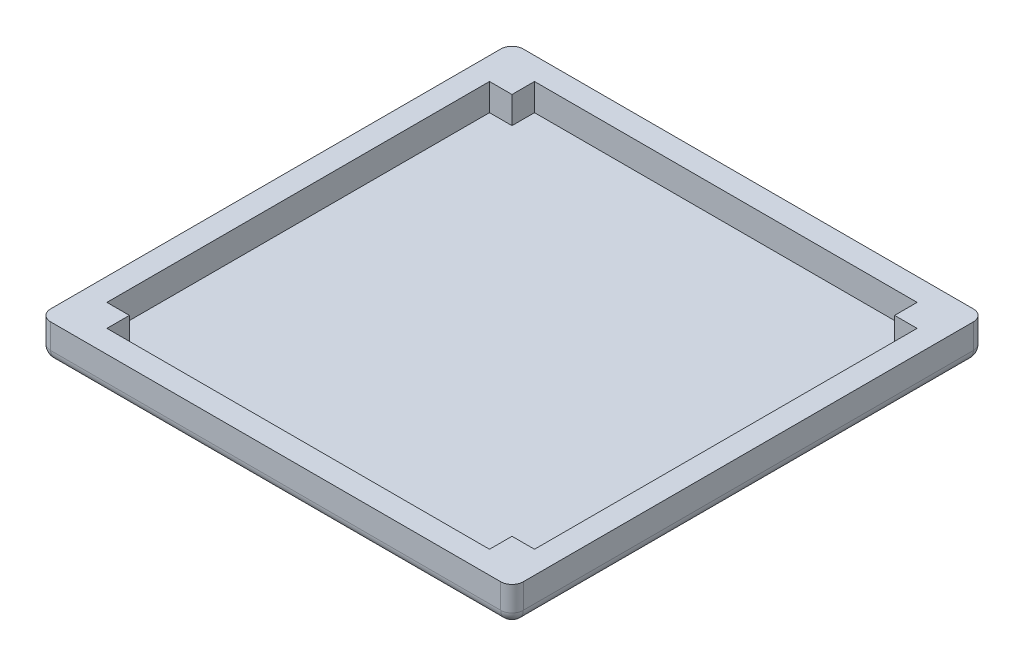
ISO-10303-21;
HEADER;
FILE_DESCRIPTION(('STEP AP214'),'2;1');
FILE_NAME('part.step','',(''),(''),'','','');
FILE_SCHEMA(('AUTOMOTIVE_DESIGN { 1 0 10303 214 1 1 1 1 }'));
ENDSEC;
DATA;
#1=APPLICATION_CONTEXT('core data for automotive mechanical design processes');
#2=APPLICATION_PROTOCOL_DEFINITION('international standard','automotive_design',2000,#1);
#3=PRODUCT_CONTEXT('',#1,'mechanical');
#4=PRODUCT('Part','Part','',(#3));
#5=PRODUCT_RELATED_PRODUCT_CATEGORY('part','',(#4));
#6=PRODUCT_DEFINITION_FORMATION('','',#4);
#7=PRODUCT_DEFINITION_CONTEXT('part definition',#1,'design');
#8=PRODUCT_DEFINITION('design','',#6,#7);
#9=PRODUCT_DEFINITION_SHAPE('','',#8);
#10=(LENGTH_UNIT() NAMED_UNIT(*) SI_UNIT(.MILLI.,.METRE.));
#11=(NAMED_UNIT(*) PLANE_ANGLE_UNIT() SI_UNIT($,.RADIAN.));
#12=(NAMED_UNIT(*) SI_UNIT($,.STERADIAN.) SOLID_ANGLE_UNIT());
#13=UNCERTAINTY_MEASURE_WITH_UNIT(LENGTH_MEASURE(1.E-05),#10,'distance_accuracy_value','');
#14=(GEOMETRIC_REPRESENTATION_CONTEXT(3) GLOBAL_UNCERTAINTY_ASSIGNED_CONTEXT((#13)) GLOBAL_UNIT_ASSIGNED_CONTEXT((#10,
#11,#12)) REPRESENTATION_CONTEXT('',''));
#15=CARTESIAN_POINT('',(0.,0.,0.));
#16=DIRECTION('',(0.,0.,1.));
#17=DIRECTION('',(1.,0.,0.));
#18=AXIS2_PLACEMENT_3D('',#15,#16,#17);
#19=CARTESIAN_POINT('',(105.,16.,105.));
#20=DIRECTION('',(-1.,0.,0.));
#21=DIRECTION('',(0.,0.,1.));
#22=AXIS2_PLACEMENT_3D('',#19,#20,#21);
#23=PLANE('',#22);
#24=DIRECTION('',(0.,0.,-1.));
#25=VECTOR('',#24,1.);
#26=CARTESIAN_POINT('',(105.,5.,-105.));
#27=LINE('',#26,#25);
#28=CARTESIAN_POINT('',(105.,5.,100.));
#29=VERTEX_POINT('',#28);
#30=CARTESIAN_POINT('',(105.,5.,-100.));
#31=VERTEX_POINT('',#30);
#32=EDGE_CURVE('E324',#29,#31,#27,.T.);
#33=ORIENTED_EDGE('',*,*,#32,.T.);
#34=DIRECTION('',(0.,-1.,0.));
#35=VECTOR('',#34,1.);
#36=CARTESIAN_POINT('',(105.,16.,-100.));
#37=LINE('',#36,#35);
#38=CARTESIAN_POINT('',(105.,16.,-100.));
#39=VERTEX_POINT('',#38);
#40=EDGE_CURVE('E353',#31,#39,#37,.F.);
#41=ORIENTED_EDGE('',*,*,#40,.T.);
#42=DIRECTION('',(0.,0.,-1.));
#43=VECTOR('',#42,1.);
#44=CARTESIAN_POINT('',(105.,16.,105.));
#45=LINE('',#44,#43);
#46=CARTESIAN_POINT('',(105.,16.,100.));
#47=VERTEX_POINT('',#46);
#48=EDGE_CURVE('E275',#47,#39,#45,.T.);
#49=ORIENTED_EDGE('',*,*,#48,.F.);
#50=DIRECTION('',(0.,-1.,0.));
#51=VECTOR('',#50,1.);
#52=CARTESIAN_POINT('',(105.,16.,100.));
#53=LINE('',#52,#51);
#54=EDGE_CURVE('E351',#47,#29,#53,.T.);
#55=ORIENTED_EDGE('',*,*,#54,.T.);
#56=EDGE_LOOP('',(#33,#41,#49,#55));
#57=FACE_BOUND('',#56,.T.);
#58=ADVANCED_FACE('F35',(#57),#23,.F.);
#59=CARTESIAN_POINT('',(-105.,16.,-105.));
#60=DIRECTION('',(0.,0.,1.));
#61=DIRECTION('',(1.,0.,0.));
#62=AXIS2_PLACEMENT_3D('',#59,#60,#61);
#63=PLANE('',#62);
#64=DIRECTION('',(-1.,0.,0.));
#65=VECTOR('',#64,1.);
#66=CARTESIAN_POINT('',(-105.,16.,-105.));
#67=LINE('',#66,#65);
#68=CARTESIAN_POINT('',(100.,16.,-105.));
#69=VERTEX_POINT('',#68);
#70=CARTESIAN_POINT('',(-100.,16.,-105.));
#71=VERTEX_POINT('',#70);
#72=EDGE_CURVE('E297',#69,#71,#67,.T.);
#73=ORIENTED_EDGE('',*,*,#72,.F.);
#74=DIRECTION('',(0.,-1.,0.));
#75=VECTOR('',#74,1.);
#76=CARTESIAN_POINT('',(100.,16.,-105.));
#77=LINE('',#76,#75);
#78=CARTESIAN_POINT('',(100.,5.,-105.));
#79=VERTEX_POINT('',#78);
#80=EDGE_CURVE('E349',#69,#79,#77,.T.);
#81=ORIENTED_EDGE('',*,*,#80,.T.);
#82=DIRECTION('',(-1.,0.,0.));
#83=VECTOR('',#82,1.);
#84=CARTESIAN_POINT('',(-105.,5.,-105.));
#85=LINE('',#84,#83);
#86=CARTESIAN_POINT('',(-100.,5.,-105.));
#87=VERTEX_POINT('',#86);
#88=EDGE_CURVE('E304',#79,#87,#85,.T.);
#89=ORIENTED_EDGE('',*,*,#88,.T.);
#90=DIRECTION('',(0.,-1.,0.));
#91=VECTOR('',#90,1.);
#92=CARTESIAN_POINT('',(-100.,16.,-105.));
#93=LINE('',#92,#91);
#94=EDGE_CURVE('E347',#87,#71,#93,.F.);
#95=ORIENTED_EDGE('',*,*,#94,.T.);
#96=EDGE_LOOP('',(#73,#81,#89,#95));
#97=FACE_BOUND('',#96,.T.);
#98=ADVANCED_FACE('F402',(#97),#63,.F.);
#99=CARTESIAN_POINT('',(-105.,16.,105.));
#100=DIRECTION('',(1.,0.,0.));
#101=DIRECTION('',(0.,0.,-1.));
#102=AXIS2_PLACEMENT_3D('',#99,#100,#101);
#103=PLANE('',#102);
#104=DIRECTION('',(0.,0.,1.));
#105=VECTOR('',#104,1.);
#106=CARTESIAN_POINT('',(-105.,16.,105.));
#107=LINE('',#106,#105);
#108=CARTESIAN_POINT('',(-105.,16.,-100.));
#109=VERTEX_POINT('',#108);
#110=CARTESIAN_POINT('',(-105.,16.,100.));
#111=VERTEX_POINT('',#110);
#112=EDGE_CURVE('E300',#109,#111,#107,.T.);
#113=ORIENTED_EDGE('',*,*,#112,.F.);
#114=DIRECTION('',(0.,-1.,0.));
#115=VECTOR('',#114,1.);
#116=CARTESIAN_POINT('',(-105.,16.,-100.));
#117=LINE('',#116,#115);
#118=CARTESIAN_POINT('',(-105.,5.,-100.));
#119=VERTEX_POINT('',#118);
#120=EDGE_CURVE('E11',#109,#119,#117,.T.);
#121=ORIENTED_EDGE('',*,*,#120,.T.);
#122=DIRECTION('',(0.,0.,1.));
#123=VECTOR('',#122,1.);
#124=CARTESIAN_POINT('',(-105.,5.,105.));
#125=LINE('',#124,#123);
#126=CARTESIAN_POINT('',(-105.,5.,100.));
#127=VERTEX_POINT('',#126);
#128=EDGE_CURVE('E319',#119,#127,#125,.T.);
#129=ORIENTED_EDGE('',*,*,#128,.T.);
#130=DIRECTION('',(0.,-1.,0.));
#131=VECTOR('',#130,1.);
#132=CARTESIAN_POINT('',(-105.,16.,100.));
#133=LINE('',#132,#131);
#134=EDGE_CURVE('E44',#127,#111,#133,.F.);
#135=ORIENTED_EDGE('',*,*,#134,.T.);
#136=EDGE_LOOP('',(#113,#121,#129,#135));
#137=FACE_BOUND('',#136,.T.);
#138=ADVANCED_FACE('F390',(#137),#103,.F.);
#139=CARTESIAN_POINT('',(-105.,16.,105.));
#140=DIRECTION('',(0.,0.,-1.));
#141=DIRECTION('',(-1.,0.,0.));
#142=AXIS2_PLACEMENT_3D('',#139,#140,#141);
#143=PLANE('',#142);
#144=DIRECTION('',(1.,0.,0.));
#145=VECTOR('',#144,1.);
#146=CARTESIAN_POINT('',(105.,5.,105.));
#147=LINE('',#146,#145);
#148=CARTESIAN_POINT('',(-100.,5.,105.));
#149=VERTEX_POINT('',#148);
#150=CARTESIAN_POINT('',(100.,5.,105.));
#151=VERTEX_POINT('',#150);
#152=EDGE_CURVE('E322',#149,#151,#147,.T.);
#153=ORIENTED_EDGE('',*,*,#152,.T.);
#154=DIRECTION('',(0.,-1.,0.));
#155=VECTOR('',#154,1.);
#156=CARTESIAN_POINT('',(100.,16.,105.));
#157=LINE('',#156,#155);
#158=CARTESIAN_POINT('',(100.,16.,105.));
#159=VERTEX_POINT('',#158);
#160=EDGE_CURVE('E52',#151,#159,#157,.F.);
#161=ORIENTED_EDGE('',*,*,#160,.T.);
#162=DIRECTION('',(1.,0.,0.));
#163=VECTOR('',#162,1.);
#164=CARTESIAN_POINT('',(-105.,16.,105.));
#165=LINE('',#164,#163);
#166=CARTESIAN_POINT('',(-100.,16.,105.));
#167=VERTEX_POINT('',#166);
#168=EDGE_CURVE('E302',#167,#159,#165,.T.);
#169=ORIENTED_EDGE('',*,*,#168,.F.);
#170=DIRECTION('',(0.,-1.,0.));
#171=VECTOR('',#170,1.);
#172=CARTESIAN_POINT('',(-100.,16.,105.));
#173=LINE('',#172,#171);
#174=EDGE_CURVE('E362',#167,#149,#173,.T.);
#175=ORIENTED_EDGE('',*,*,#174,.T.);
#176=EDGE_LOOP('',(#153,#161,#169,#175));
#177=FACE_BOUND('',#176,.T.);
#178=ADVANCED_FACE('F422',(#177),#143,.F.);
#179=CARTESIAN_POINT('',(0.,16.,0.));
#180=DIRECTION('',(0.,-1.,0.));
#181=DIRECTION('',(0.,0.,-1.));
#182=AXIS2_PLACEMENT_3D('',#179,#180,#181);
#183=PLANE('',#182);
#184=DIRECTION('',(-1.,0.,0.));
#185=VECTOR('',#184,1.);
#186=CARTESIAN_POINT('',(-95.0000000000035,16.,-85.0000000000036));
#187=LINE('',#186,#185);
#188=CARTESIAN_POINT('',(-85.0000000000035,16.,-85.0000000000035));
#189=VERTEX_POINT('',#188);
#190=CARTESIAN_POINT('',(-95.0000000000035,16.,-85.0000000000036));
#191=VERTEX_POINT('',#190);
#192=EDGE_CURVE('E244',#189,#191,#187,.T.);
#193=ORIENTED_EDGE('',*,*,#192,.F.);
#194=DIRECTION('',(0.,0.,1.));
#195=VECTOR('',#194,1.);
#196=CARTESIAN_POINT('',(-85.0000000000031,16.,-95.0000000000038));
#197=LINE('',#196,#195);
#198=CARTESIAN_POINT('',(-85.0000000000031,16.,-95.0000000000038));
#199=VERTEX_POINT('',#198);
#200=EDGE_CURVE('E194',#199,#189,#197,.T.);
#201=ORIENTED_EDGE('',*,*,#200,.F.);
#202=DIRECTION('',(-1.,0.,0.));
#203=VECTOR('',#202,1.);
#204=CARTESIAN_POINT('',(-85.0000000000031,16.,-95.0000000000038));
#205=LINE('',#204,#203);
#206=CARTESIAN_POINT('',(85.0000000000035,16.,-95.0000000000038));
#207=VERTEX_POINT('',#206);
#208=EDGE_CURVE('E212',#207,#199,#205,.T.);
#209=ORIENTED_EDGE('',*,*,#208,.F.);
#210=DIRECTION('',(0.,0.,-1.));
#211=VECTOR('',#210,1.);
#212=CARTESIAN_POINT('',(85.0000000000035,16.,-95.0000000000038));
#213=LINE('',#212,#211);
#214=CARTESIAN_POINT('',(85.0000000000035,16.,-85.0000000000036));
#215=VERTEX_POINT('',#214);
#216=EDGE_CURVE('E215',#215,#207,#213,.T.);
#217=ORIENTED_EDGE('',*,*,#216,.F.);
#218=DIRECTION('',(-1.,0.,0.));
#219=VECTOR('',#218,1.);
#220=CARTESIAN_POINT('',(95.0000000000039,16.,-85.0000000000036));
#221=LINE('',#220,#219);
#222=CARTESIAN_POINT('',(95.0000000000039,16.,-85.0000000000036));
#223=VERTEX_POINT('',#222);
#224=EDGE_CURVE('E268',#223,#215,#221,.T.);
#225=ORIENTED_EDGE('',*,*,#224,.F.);
#226=DIRECTION('',(0.,0.,-1.));
#227=VECTOR('',#226,1.);
#228=CARTESIAN_POINT('',(95.0000000000039,16.,-85.0000000000036));
#229=LINE('',#228,#227);
#230=CARTESIAN_POINT('',(95.0000000000039,16.,85.0000000000031));
#231=VERTEX_POINT('',#230);
#232=EDGE_CURVE('E265',#231,#223,#229,.T.);
#233=ORIENTED_EDGE('',*,*,#232,.F.);
#234=DIRECTION('',(1.,0.,0.));
#235=VECTOR('',#234,1.);
#236=CARTESIAN_POINT('',(95.0000000000039,16.,85.0000000000031));
#237=LINE('',#236,#235);
#238=CARTESIAN_POINT('',(85.0000000000035,16.,85.0000000000031));
#239=VERTEX_POINT('',#238);
#240=EDGE_CURVE('E262',#239,#231,#237,.T.);
#241=ORIENTED_EDGE('',*,*,#240,.F.);
#242=DIRECTION('',(0.,0.,-1.));
#243=VECTOR('',#242,1.);
#244=CARTESIAN_POINT('',(85.0000000000035,16.,95.0000000000035));
#245=LINE('',#244,#243);
#246=CARTESIAN_POINT('',(85.0000000000035,16.,95.0000000000035));
#247=VERTEX_POINT('',#246);
#248=EDGE_CURVE('E259',#247,#239,#245,.T.);
#249=ORIENTED_EDGE('',*,*,#248,.F.);
#250=DIRECTION('',(1.,0.,0.));
#251=VECTOR('',#250,1.);
#252=CARTESIAN_POINT('',(-85.0000000000031,16.,95.0000000000034));
#253=LINE('',#252,#251);
#254=CARTESIAN_POINT('',(-85.0000000000031,16.,95.0000000000034));
#255=VERTEX_POINT('',#254);
#256=EDGE_CURVE('E256',#255,#247,#253,.T.);
#257=ORIENTED_EDGE('',*,*,#256,.F.);
#258=DIRECTION('',(0.,0.,1.));
#259=VECTOR('',#258,1.);
#260=CARTESIAN_POINT('',(-85.0000000000031,16.,95.0000000000034));
#261=LINE('',#260,#259);
#262=CARTESIAN_POINT('',(-85.0000000000031,16.,85.0000000000031));
#263=VERTEX_POINT('',#262);
#264=EDGE_CURVE('E253',#263,#255,#261,.T.);
#265=ORIENTED_EDGE('',*,*,#264,.F.);
#266=DIRECTION('',(1.,0.,0.));
#267=VECTOR('',#266,1.);
#268=CARTESIAN_POINT('',(-95.0000000000035,16.,85.0000000000031));
#269=LINE('',#268,#267);
#270=CARTESIAN_POINT('',(-95.0000000000035,16.,85.0000000000031));
#271=VERTEX_POINT('',#270);
#272=EDGE_CURVE('E250',#271,#263,#269,.T.);
#273=ORIENTED_EDGE('',*,*,#272,.F.);
#274=DIRECTION('',(0.,0.,1.));
#275=VECTOR('',#274,1.);
#276=CARTESIAN_POINT('',(-95.0000000000035,16.,-85.0000000000036));
#277=LINE('',#276,#275);
#278=EDGE_CURVE('E247',#191,#271,#277,.T.);
#279=ORIENTED_EDGE('',*,*,#278,.F.);
#280=EDGE_LOOP('',(#193,#201,#209,#217,#225,#233,#241,#249,#257,#265,#273,#279));
#281=FACE_BOUND('',#280,.T.);
#282=ORIENTED_EDGE('',*,*,#48,.T.);
#283=CARTESIAN_POINT('',(100.,16.,-100.));
#284=DIRECTION('',(0.,-1.,0.));
#285=DIRECTION('',(0.,0.,-1.));
#286=AXIS2_PLACEMENT_3D('',#283,#284,#285);
#287=CIRCLE('',#286,5.);
#288=EDGE_CURVE('E360',#39,#69,#287,.F.);
#289=ORIENTED_EDGE('',*,*,#288,.T.);
#290=ORIENTED_EDGE('',*,*,#72,.T.);
#291=CARTESIAN_POINT('',(-100.,16.,-100.));
#292=DIRECTION('',(0.,-1.,0.));
#293=DIRECTION('',(0.,0.,-1.));
#294=AXIS2_PLACEMENT_3D('',#291,#292,#293);
#295=CIRCLE('',#294,5.);
#296=EDGE_CURVE('E356',#71,#109,#295,.F.);
#297=ORIENTED_EDGE('',*,*,#296,.T.);
#298=ORIENTED_EDGE('',*,*,#112,.T.);
#299=CARTESIAN_POINT('',(-100.,16.,100.));
#300=DIRECTION('',(0.,-1.,0.));
#301=DIRECTION('',(0.,0.,-1.));
#302=AXIS2_PLACEMENT_3D('',#299,#300,#301);
#303=CIRCLE('',#302,5.);
#304=EDGE_CURVE('E59',#111,#167,#303,.F.);
#305=ORIENTED_EDGE('',*,*,#304,.T.);
#306=ORIENTED_EDGE('',*,*,#168,.T.);
#307=CARTESIAN_POINT('',(100.,16.,100.));
#308=DIRECTION('',(0.,-1.,0.));
#309=DIRECTION('',(0.,0.,-1.));
#310=AXIS2_PLACEMENT_3D('',#307,#308,#309);
#311=CIRCLE('',#310,5.);
#312=EDGE_CURVE('E358',#159,#47,#311,.F.);
#313=ORIENTED_EDGE('',*,*,#312,.T.);
#314=EDGE_LOOP('',(#282,#289,#290,#297,#298,#305,#306,#313));
#315=FACE_BOUND('',#314,.T.);
#316=ADVANCED_FACE('F655',(#281,#315),#183,.F.);
#317=CARTESIAN_POINT('',(0.,0.,0.));
#318=DIRECTION('',(0.,-1.,0.));
#319=DIRECTION('',(0.,0.,-1.));
#320=AXIS2_PLACEMENT_3D('',#317,#318,#319);
#321=PLANE('',#320);
#322=DIRECTION('',(0.,0.,1.));
#323=VECTOR('',#322,1.);
#324=CARTESIAN_POINT('',(-100.,0.,-105.));
#325=LINE('',#324,#323);
#326=CARTESIAN_POINT('',(-100.,0.,100.));
#327=VERTEX_POINT('',#326);
#328=CARTESIAN_POINT('',(-100.,0.,-100.));
#329=VERTEX_POINT('',#328);
#330=EDGE_CURVE('E313',#327,#329,#325,.F.);
#331=ORIENTED_EDGE('',*,*,#330,.T.);
#332=DIRECTION('',(-1.,0.,0.));
#333=VECTOR('',#332,1.);
#334=CARTESIAN_POINT('',(105.,0.,-100.));
#335=LINE('',#334,#333);
#336=CARTESIAN_POINT('',(100.,0.,-100.));
#337=VERTEX_POINT('',#336);
#338=EDGE_CURVE('E316',#329,#337,#335,.F.);
#339=ORIENTED_EDGE('',*,*,#338,.T.);
#340=DIRECTION('',(0.,0.,-1.));
#341=VECTOR('',#340,1.);
#342=CARTESIAN_POINT('',(100.,0.,105.));
#343=LINE('',#342,#341);
#344=CARTESIAN_POINT('',(100.,0.,100.));
#345=VERTEX_POINT('',#344);
#346=EDGE_CURVE('E307',#337,#345,#343,.F.);
#347=ORIENTED_EDGE('',*,*,#346,.T.);
#348=DIRECTION('',(1.,0.,0.));
#349=VECTOR('',#348,1.);
#350=CARTESIAN_POINT('',(-105.,0.,100.));
#351=LINE('',#350,#349);
#352=EDGE_CURVE('E310',#345,#327,#351,.F.);
#353=ORIENTED_EDGE('',*,*,#352,.T.);
#354=EDGE_LOOP('',(#331,#339,#347,#353));
#355=FACE_BOUND('',#354,.T.);
#356=ADVANCED_FACE('F418',(#355),#321,.T.);
#357=CARTESIAN_POINT('',(-85.0000000000031,4.,-95.0000000000038));
#358=DIRECTION('',(-1.,0.,0.));
#359=DIRECTION('',(0.,0.,1.));
#360=AXIS2_PLACEMENT_3D('',#357,#358,#359);
#361=PLANE('',#360);
#362=ORIENTED_EDGE('',*,*,#200,.T.);
#363=DIRECTION('',(0.,1.,0.));
#364=VECTOR('',#363,1.);
#365=CARTESIAN_POINT('',(-85.0000000000035,4.,-85.0000000000035));
#366=LINE('',#365,#364);
#367=CARTESIAN_POINT('',(-85.0000000000035,4.,-85.0000000000035));
#368=VERTEX_POINT('',#367);
#369=EDGE_CURVE('E187',#368,#189,#366,.T.);
#370=ORIENTED_EDGE('',*,*,#369,.F.);
#371=DIRECTION('',(0.,0.,1.));
#372=VECTOR('',#371,1.);
#373=CARTESIAN_POINT('',(-85.0000000000031,4.,-95.0000000000038));
#374=LINE('',#373,#372);
#375=CARTESIAN_POINT('',(-85.0000000000031,4.,-95.0000000000038));
#376=VERTEX_POINT('',#375);
#377=EDGE_CURVE('E191',#376,#368,#374,.T.);
#378=ORIENTED_EDGE('',*,*,#377,.F.);
#379=DIRECTION('',(0.,1.,0.));
#380=VECTOR('',#379,1.);
#381=CARTESIAN_POINT('',(-85.0000000000031,4.,-95.0000000000038));
#382=LINE('',#381,#380);
#383=EDGE_CURVE('E273',#376,#199,#382,.T.);
#384=ORIENTED_EDGE('',*,*,#383,.T.);
#385=EDGE_LOOP('',(#362,#370,#378,#384));
#386=FACE_BOUND('',#385,.T.);
#387=ADVANCED_FACE('F189',(#386),#361,.F.);
#388=CARTESIAN_POINT('',(-85.0000000000031,4.,-95.0000000000038));
#389=DIRECTION('',(0.,0.,-1.));
#390=DIRECTION('',(-1.,0.,0.));
#391=AXIS2_PLACEMENT_3D('',#388,#389,#390);
#392=PLANE('',#391);
#393=ORIENTED_EDGE('',*,*,#208,.T.);
#394=ORIENTED_EDGE('',*,*,#383,.F.);
#395=DIRECTION('',(-1.,0.,0.));
#396=VECTOR('',#395,1.);
#397=CARTESIAN_POINT('',(-85.0000000000031,4.,-95.0000000000038));
#398=LINE('',#397,#396);
#399=CARTESIAN_POINT('',(85.0000000000035,4.,-95.0000000000038));
#400=VERTEX_POINT('',#399);
#401=EDGE_CURVE('E199',#400,#376,#398,.T.);
#402=ORIENTED_EDGE('',*,*,#401,.F.);
#403=DIRECTION('',(0.,1.,0.));
#404=VECTOR('',#403,1.);
#405=CARTESIAN_POINT('',(85.0000000000035,4.,-95.0000000000038));
#406=LINE('',#405,#404);
#407=EDGE_CURVE('E276',#400,#207,#406,.T.);
#408=ORIENTED_EDGE('',*,*,#407,.T.);
#409=EDGE_LOOP('',(#393,#394,#402,#408));
#410=FACE_BOUND('',#409,.T.);
#411=ADVANCED_FACE('F632',(#410),#392,.F.);
#412=CARTESIAN_POINT('',(85.0000000000035,4.,-95.0000000000038));
#413=DIRECTION('',(1.,0.,0.));
#414=DIRECTION('',(0.,0.,-1.));
#415=AXIS2_PLACEMENT_3D('',#412,#413,#414);
#416=PLANE('',#415);
#417=ORIENTED_EDGE('',*,*,#216,.T.);
#418=ORIENTED_EDGE('',*,*,#407,.F.);
#419=DIRECTION('',(0.,0.,-1.));
#420=VECTOR('',#419,1.);
#421=CARTESIAN_POINT('',(85.0000000000035,4.,-95.0000000000038));
#422=LINE('',#421,#420);
#423=CARTESIAN_POINT('',(85.0000000000035,4.,-85.0000000000036));
#424=VERTEX_POINT('',#423);
#425=EDGE_CURVE('E240',#424,#400,#422,.T.);
#426=ORIENTED_EDGE('',*,*,#425,.F.);
#427=DIRECTION('',(0.,1.,0.));
#428=VECTOR('',#427,1.);
#429=CARTESIAN_POINT('',(85.0000000000035,4.,-85.0000000000036));
#430=LINE('',#429,#428);
#431=EDGE_CURVE('E278',#424,#215,#430,.T.);
#432=ORIENTED_EDGE('',*,*,#431,.T.);
#433=EDGE_LOOP('',(#417,#418,#426,#432));
#434=FACE_BOUND('',#433,.T.);
#435=ADVANCED_FACE('F623',(#434),#416,.F.);
#436=CARTESIAN_POINT('',(95.0000000000039,4.,-85.0000000000036));
#437=DIRECTION('',(0.,0.,-1.));
#438=DIRECTION('',(-1.,0.,0.));
#439=AXIS2_PLACEMENT_3D('',#436,#437,#438);
#440=PLANE('',#439);
#441=ORIENTED_EDGE('',*,*,#224,.T.);
#442=ORIENTED_EDGE('',*,*,#431,.F.);
#443=DIRECTION('',(-1.,0.,0.));
#444=VECTOR('',#443,1.);
#445=CARTESIAN_POINT('',(95.0000000000039,4.,-85.0000000000036));
#446=LINE('',#445,#444);
#447=CARTESIAN_POINT('',(95.0000000000039,4.,-85.0000000000036));
#448=VERTEX_POINT('',#447);
#449=EDGE_CURVE('E237',#448,#424,#446,.T.);
#450=ORIENTED_EDGE('',*,*,#449,.F.);
#451=DIRECTION('',(0.,1.,0.));
#452=VECTOR('',#451,1.);
#453=CARTESIAN_POINT('',(95.0000000000039,4.,-85.0000000000036));
#454=LINE('',#453,#452);
#455=EDGE_CURVE('E280',#448,#223,#454,.T.);
#456=ORIENTED_EDGE('',*,*,#455,.T.);
#457=EDGE_LOOP('',(#441,#442,#450,#456));
#458=FACE_BOUND('',#457,.T.);
#459=ADVANCED_FACE('F614',(#458),#440,.F.);
#460=CARTESIAN_POINT('',(95.0000000000039,4.,-85.0000000000036));
#461=DIRECTION('',(1.,0.,0.));
#462=DIRECTION('',(0.,0.,-1.));
#463=AXIS2_PLACEMENT_3D('',#460,#461,#462);
#464=PLANE('',#463);
#465=ORIENTED_EDGE('',*,*,#232,.T.);
#466=ORIENTED_EDGE('',*,*,#455,.F.);
#467=DIRECTION('',(0.,0.,-1.));
#468=VECTOR('',#467,1.);
#469=CARTESIAN_POINT('',(95.0000000000039,4.,-85.0000000000036));
#470=LINE('',#469,#468);
#471=CARTESIAN_POINT('',(95.0000000000039,4.,85.0000000000031));
#472=VERTEX_POINT('',#471);
#473=EDGE_CURVE('E234',#472,#448,#470,.T.);
#474=ORIENTED_EDGE('',*,*,#473,.F.);
#475=DIRECTION('',(0.,1.,0.));
#476=VECTOR('',#475,1.);
#477=CARTESIAN_POINT('',(95.0000000000039,4.,85.0000000000031));
#478=LINE('',#477,#476);
#479=EDGE_CURVE('E282',#472,#231,#478,.T.);
#480=ORIENTED_EDGE('',*,*,#479,.T.);
#481=EDGE_LOOP('',(#465,#466,#474,#480));
#482=FACE_BOUND('',#481,.T.);
#483=ADVANCED_FACE('F605',(#482),#464,.F.);
#484=CARTESIAN_POINT('',(95.0000000000039,4.,85.0000000000031));
#485=DIRECTION('',(0.,0.,1.));
#486=DIRECTION('',(1.,0.,0.));
#487=AXIS2_PLACEMENT_3D('',#484,#485,#486);
#488=PLANE('',#487);
#489=ORIENTED_EDGE('',*,*,#240,.T.);
#490=ORIENTED_EDGE('',*,*,#479,.F.);
#491=DIRECTION('',(1.,0.,0.));
#492=VECTOR('',#491,1.);
#493=CARTESIAN_POINT('',(95.0000000000039,4.,85.0000000000031));
#494=LINE('',#493,#492);
#495=CARTESIAN_POINT('',(85.0000000000035,4.,85.0000000000031));
#496=VERTEX_POINT('',#495);
#497=EDGE_CURVE('E231',#496,#472,#494,.T.);
#498=ORIENTED_EDGE('',*,*,#497,.F.);
#499=DIRECTION('',(0.,1.,0.));
#500=VECTOR('',#499,1.);
#501=CARTESIAN_POINT('',(85.0000000000035,4.,85.0000000000031));
#502=LINE('',#501,#500);
#503=EDGE_CURVE('E284',#496,#239,#502,.T.);
#504=ORIENTED_EDGE('',*,*,#503,.T.);
#505=EDGE_LOOP('',(#489,#490,#498,#504));
#506=FACE_BOUND('',#505,.T.);
#507=ADVANCED_FACE('F596',(#506),#488,.F.);
#508=CARTESIAN_POINT('',(85.0000000000035,4.,95.0000000000035));
#509=DIRECTION('',(1.,0.,0.));
#510=DIRECTION('',(0.,0.,-1.));
#511=AXIS2_PLACEMENT_3D('',#508,#509,#510);
#512=PLANE('',#511);
#513=ORIENTED_EDGE('',*,*,#248,.T.);
#514=ORIENTED_EDGE('',*,*,#503,.F.);
#515=DIRECTION('',(0.,0.,-1.));
#516=VECTOR('',#515,1.);
#517=CARTESIAN_POINT('',(85.0000000000035,4.,95.0000000000035));
#518=LINE('',#517,#516);
#519=CARTESIAN_POINT('',(85.0000000000035,4.,95.0000000000035));
#520=VERTEX_POINT('',#519);
#521=EDGE_CURVE('E228',#520,#496,#518,.T.);
#522=ORIENTED_EDGE('',*,*,#521,.F.);
#523=DIRECTION('',(0.,1.,0.));
#524=VECTOR('',#523,1.);
#525=CARTESIAN_POINT('',(85.0000000000035,4.,95.0000000000035));
#526=LINE('',#525,#524);
#527=EDGE_CURVE('E286',#520,#247,#526,.T.);
#528=ORIENTED_EDGE('',*,*,#527,.T.);
#529=EDGE_LOOP('',(#513,#514,#522,#528));
#530=FACE_BOUND('',#529,.T.);
#531=ADVANCED_FACE('F587',(#530),#512,.F.);
#532=CARTESIAN_POINT('',(-85.0000000000031,4.,95.0000000000034));
#533=DIRECTION('',(0.,0.,1.));
#534=DIRECTION('',(1.,0.,0.));
#535=AXIS2_PLACEMENT_3D('',#532,#533,#534);
#536=PLANE('',#535);
#537=ORIENTED_EDGE('',*,*,#256,.T.);
#538=ORIENTED_EDGE('',*,*,#527,.F.);
#539=DIRECTION('',(1.,0.,0.));
#540=VECTOR('',#539,1.);
#541=CARTESIAN_POINT('',(-85.0000000000031,4.,95.0000000000034));
#542=LINE('',#541,#540);
#543=CARTESIAN_POINT('',(-85.0000000000031,4.,95.0000000000034));
#544=VERTEX_POINT('',#543);
#545=EDGE_CURVE('E225',#544,#520,#542,.T.);
#546=ORIENTED_EDGE('',*,*,#545,.F.);
#547=DIRECTION('',(0.,1.,0.));
#548=VECTOR('',#547,1.);
#549=CARTESIAN_POINT('',(-85.0000000000031,4.,95.0000000000034));
#550=LINE('',#549,#548);
#551=EDGE_CURVE('E288',#544,#255,#550,.T.);
#552=ORIENTED_EDGE('',*,*,#551,.T.);
#553=EDGE_LOOP('',(#537,#538,#546,#552));
#554=FACE_BOUND('',#553,.T.);
#555=ADVANCED_FACE('F578',(#554),#536,.F.);
#556=CARTESIAN_POINT('',(-85.0000000000031,4.,95.0000000000034));
#557=DIRECTION('',(-1.,0.,0.));
#558=DIRECTION('',(0.,0.,1.));
#559=AXIS2_PLACEMENT_3D('',#556,#557,#558);
#560=PLANE('',#559);
#561=ORIENTED_EDGE('',*,*,#264,.T.);
#562=ORIENTED_EDGE('',*,*,#551,.F.);
#563=DIRECTION('',(0.,0.,1.));
#564=VECTOR('',#563,1.);
#565=CARTESIAN_POINT('',(-85.0000000000031,4.,95.0000000000034));
#566=LINE('',#565,#564);
#567=CARTESIAN_POINT('',(-85.0000000000031,4.,85.0000000000031));
#568=VERTEX_POINT('',#567);
#569=EDGE_CURVE('E222',#568,#544,#566,.T.);
#570=ORIENTED_EDGE('',*,*,#569,.F.);
#571=DIRECTION('',(0.,1.,0.));
#572=VECTOR('',#571,1.);
#573=CARTESIAN_POINT('',(-85.0000000000031,4.,85.0000000000031));
#574=LINE('',#573,#572);
#575=EDGE_CURVE('E290',#568,#263,#574,.T.);
#576=ORIENTED_EDGE('',*,*,#575,.T.);
#577=EDGE_LOOP('',(#561,#562,#570,#576));
#578=FACE_BOUND('',#577,.T.);
#579=ADVANCED_FACE('F569',(#578),#560,.F.);
#580=CARTESIAN_POINT('',(-95.0000000000035,4.,85.0000000000031));
#581=DIRECTION('',(0.,0.,1.));
#582=DIRECTION('',(1.,0.,0.));
#583=AXIS2_PLACEMENT_3D('',#580,#581,#582);
#584=PLANE('',#583);
#585=ORIENTED_EDGE('',*,*,#272,.T.);
#586=ORIENTED_EDGE('',*,*,#575,.F.);
#587=DIRECTION('',(1.,0.,0.));
#588=VECTOR('',#587,1.);
#589=CARTESIAN_POINT('',(-95.0000000000035,4.,85.0000000000031));
#590=LINE('',#589,#588);
#591=CARTESIAN_POINT('',(-95.0000000000035,4.,85.0000000000031));
#592=VERTEX_POINT('',#591);
#593=EDGE_CURVE('E219',#592,#568,#590,.T.);
#594=ORIENTED_EDGE('',*,*,#593,.F.);
#595=DIRECTION('',(0.,1.,0.));
#596=VECTOR('',#595,1.);
#597=CARTESIAN_POINT('',(-95.0000000000035,4.,85.0000000000031));
#598=LINE('',#597,#596);
#599=EDGE_CURVE('E292',#592,#271,#598,.T.);
#600=ORIENTED_EDGE('',*,*,#599,.T.);
#601=EDGE_LOOP('',(#585,#586,#594,#600));
#602=FACE_BOUND('',#601,.T.);
#603=ADVANCED_FACE('F560',(#602),#584,.F.);
#604=CARTESIAN_POINT('',(-95.0000000000035,4.,-85.0000000000036));
#605=DIRECTION('',(-1.,0.,0.));
#606=DIRECTION('',(0.,0.,1.));
#607=AXIS2_PLACEMENT_3D('',#604,#605,#606);
#608=PLANE('',#607);
#609=ORIENTED_EDGE('',*,*,#278,.T.);
#610=ORIENTED_EDGE('',*,*,#599,.F.);
#611=DIRECTION('',(0.,0.,1.));
#612=VECTOR('',#611,1.);
#613=CARTESIAN_POINT('',(-95.0000000000035,4.,-85.0000000000036));
#614=LINE('',#613,#612);
#615=CARTESIAN_POINT('',(-95.0000000000035,4.,-85.0000000000036));
#616=VERTEX_POINT('',#615);
#617=EDGE_CURVE('E207',#616,#592,#614,.T.);
#618=ORIENTED_EDGE('',*,*,#617,.F.);
#619=DIRECTION('',(0.,1.,0.));
#620=VECTOR('',#619,1.);
#621=CARTESIAN_POINT('',(-95.0000000000035,4.,-85.0000000000036));
#622=LINE('',#621,#620);
#623=EDGE_CURVE('E198',#616,#191,#622,.T.);
#624=ORIENTED_EDGE('',*,*,#623,.T.);
#625=EDGE_LOOP('',(#609,#610,#618,#624));
#626=FACE_BOUND('',#625,.T.);
#627=ADVANCED_FACE('F552',(#626),#608,.F.);
#628=CARTESIAN_POINT('',(-95.0000000000035,4.,-85.0000000000036));
#629=DIRECTION('',(0.,0.,-1.));
#630=DIRECTION('',(-1.,0.,0.));
#631=AXIS2_PLACEMENT_3D('',#628,#629,#630);
#632=PLANE('',#631);
#633=ORIENTED_EDGE('',*,*,#192,.T.);
#634=ORIENTED_EDGE('',*,*,#623,.F.);
#635=DIRECTION('',(-1.,0.,0.));
#636=VECTOR('',#635,1.);
#637=CARTESIAN_POINT('',(-95.0000000000035,4.,-85.0000000000036));
#638=LINE('',#637,#636);
#639=EDGE_CURVE('E202',#368,#616,#638,.T.);
#640=ORIENTED_EDGE('',*,*,#639,.F.);
#641=ORIENTED_EDGE('',*,*,#369,.T.);
#642=EDGE_LOOP('',(#633,#634,#640,#641));
#643=FACE_BOUND('',#642,.T.);
#644=ADVANCED_FACE('F203',(#643),#632,.F.);
#645=CARTESIAN_POINT('',(0.,4.,0.));
#646=DIRECTION('',(0.,1.,0.));
#647=DIRECTION('',(0.,0.,1.));
#648=AXIS2_PLACEMENT_3D('',#645,#646,#647);
#649=PLANE('',#648);
#650=ORIENTED_EDGE('',*,*,#377,.T.);
#651=ORIENTED_EDGE('',*,*,#639,.T.);
#652=ORIENTED_EDGE('',*,*,#617,.T.);
#653=ORIENTED_EDGE('',*,*,#593,.T.);
#654=ORIENTED_EDGE('',*,*,#569,.T.);
#655=ORIENTED_EDGE('',*,*,#545,.T.);
#656=ORIENTED_EDGE('',*,*,#521,.T.);
#657=ORIENTED_EDGE('',*,*,#497,.T.);
#658=ORIENTED_EDGE('',*,*,#473,.T.);
#659=ORIENTED_EDGE('',*,*,#449,.T.);
#660=ORIENTED_EDGE('',*,*,#425,.T.);
#661=ORIENTED_EDGE('',*,*,#401,.T.);
#662=EDGE_LOOP('',(#650,#651,#652,#653,#654,#655,#656,#657,#658,#659,#660,#661));
#663=FACE_BOUND('',#662,.T.);
#664=ADVANCED_FACE('F209',(#663),#649,.T.);
#665=CARTESIAN_POINT('',(-105.,5.,100.));
#666=DIRECTION('',(-1.,0.,0.));
#667=DIRECTION('',(0.,0.,1.));
#668=AXIS2_PLACEMENT_3D('',#665,#666,#667);
#669=CYLINDRICAL_SURFACE('',#668,5.);
#670=ORIENTED_EDGE('',*,*,#352,.F.);
#671=CARTESIAN_POINT('',(100.,5.,100.));
#672=DIRECTION('',(-1.,0.,0.));
#673=DIRECTION('',(0.,0.,1.));
#674=AXIS2_PLACEMENT_3D('',#671,#672,#673);
#675=CIRCLE('',#674,5.);
#676=EDGE_CURVE('E340',#345,#151,#675,.T.);
#677=ORIENTED_EDGE('',*,*,#676,.T.);
#678=ORIENTED_EDGE('',*,*,#152,.F.);
#679=CARTESIAN_POINT('',(-100.,5.,100.));
#680=DIRECTION('',(-1.,0.,0.));
#681=DIRECTION('',(0.,0.,1.));
#682=AXIS2_PLACEMENT_3D('',#679,#680,#681);
#683=CIRCLE('',#682,5.);
#684=EDGE_CURVE('E338',#149,#327,#683,.F.);
#685=ORIENTED_EDGE('',*,*,#684,.T.);
#686=EDGE_LOOP('',(#670,#677,#678,#685));
#687=FACE_BOUND('',#686,.T.);
#688=ADVANCED_FACE('F420',(#687),#669,.T.);
#689=CARTESIAN_POINT('',(100.,5.,105.));
#690=DIRECTION('',(0.,0.,1.));
#691=DIRECTION('',(1.,0.,0.));
#692=AXIS2_PLACEMENT_3D('',#689,#690,#691);
#693=CYLINDRICAL_SURFACE('',#692,5.);
#694=ORIENTED_EDGE('',*,*,#346,.F.);
#695=CARTESIAN_POINT('',(100.,5.,-100.));
#696=DIRECTION('',(0.,0.,1.));
#697=DIRECTION('',(1.,0.,0.));
#698=AXIS2_PLACEMENT_3D('',#695,#696,#697);
#699=CIRCLE('',#698,5.);
#700=EDGE_CURVE('E336',#337,#31,#699,.T.);
#701=ORIENTED_EDGE('',*,*,#700,.T.);
#702=ORIENTED_EDGE('',*,*,#32,.F.);
#703=CARTESIAN_POINT('',(100.,5.,100.));
#704=DIRECTION('',(0.,0.,1.));
#705=DIRECTION('',(1.,0.,0.));
#706=AXIS2_PLACEMENT_3D('',#703,#704,#705);
#707=CIRCLE('',#706,5.);
#708=EDGE_CURVE('E333',#29,#345,#707,.F.);
#709=ORIENTED_EDGE('',*,*,#708,.T.);
#710=EDGE_LOOP('',(#694,#701,#702,#709));
#711=FACE_BOUND('',#710,.T.);
#712=ADVANCED_FACE('F413',(#711),#693,.T.);
#713=CARTESIAN_POINT('',(-100.,5.,105.));
#714=DIRECTION('',(0.,0.,-1.));
#715=DIRECTION('',(-1.,0.,0.));
#716=AXIS2_PLACEMENT_3D('',#713,#714,#715);
#717=CYLINDRICAL_SURFACE('',#716,5.);
#718=ORIENTED_EDGE('',*,*,#128,.F.);
#719=CARTESIAN_POINT('',(-100.,5.,-100.));
#720=DIRECTION('',(0.,0.,-1.));
#721=DIRECTION('',(-1.,0.,0.));
#722=AXIS2_PLACEMENT_3D('',#719,#720,#721);
#723=CIRCLE('',#722,5.);
#724=EDGE_CURVE('E345',#119,#329,#723,.F.);
#725=ORIENTED_EDGE('',*,*,#724,.T.);
#726=ORIENTED_EDGE('',*,*,#330,.F.);
#727=CARTESIAN_POINT('',(-100.,5.,100.));
#728=DIRECTION('',(0.,0.,-1.));
#729=DIRECTION('',(-1.,0.,0.));
#730=AXIS2_PLACEMENT_3D('',#727,#728,#729);
#731=CIRCLE('',#730,5.);
#732=EDGE_CURVE('E342',#327,#127,#731,.T.);
#733=ORIENTED_EDGE('',*,*,#732,.T.);
#734=EDGE_LOOP('',(#718,#725,#726,#733));
#735=FACE_BOUND('',#734,.T.);
#736=ADVANCED_FACE('F389',(#735),#717,.T.);
#737=CARTESIAN_POINT('',(-105.,5.,-100.));
#738=DIRECTION('',(1.,0.,0.));
#739=DIRECTION('',(0.,0.,-1.));
#740=AXIS2_PLACEMENT_3D('',#737,#738,#739);
#741=CYLINDRICAL_SURFACE('',#740,5.);
#742=ORIENTED_EDGE('',*,*,#88,.F.);
#743=CARTESIAN_POINT('',(100.,5.,-100.));
#744=DIRECTION('',(1.,0.,0.));
#745=DIRECTION('',(0.,0.,-1.));
#746=AXIS2_PLACEMENT_3D('',#743,#744,#745);
#747=CIRCLE('',#746,5.);
#748=EDGE_CURVE('E330',#79,#337,#747,.F.);
#749=ORIENTED_EDGE('',*,*,#748,.T.);
#750=ORIENTED_EDGE('',*,*,#338,.F.);
#751=CARTESIAN_POINT('',(-100.,5.,-100.));
#752=DIRECTION('',(1.,0.,0.));
#753=DIRECTION('',(0.,0.,-1.));
#754=AXIS2_PLACEMENT_3D('',#751,#752,#753);
#755=CIRCLE('',#754,5.);
#756=EDGE_CURVE('E327',#329,#87,#755,.T.);
#757=ORIENTED_EDGE('',*,*,#756,.T.);
#758=EDGE_LOOP('',(#742,#749,#750,#757));
#759=FACE_BOUND('',#758,.T.);
#760=ADVANCED_FACE('F400',(#759),#741,.T.);
#761=CARTESIAN_POINT('',(100.,16.,-100.));
#762=DIRECTION('',(0.,-1.,0.));
#763=DIRECTION('',(0.,0.,-1.));
#764=AXIS2_PLACEMENT_3D('',#761,#762,#763);
#765=CYLINDRICAL_SURFACE('',#764,5.);
#766=ORIENTED_EDGE('',*,*,#288,.F.);
#767=ORIENTED_EDGE('',*,*,#40,.F.);
#768=CARTESIAN_POINT('',(100.,5.,-100.));
#769=DIRECTION('',(0.,-1.,0.));
#770=DIRECTION('',(0.,0.,-1.));
#771=AXIS2_PLACEMENT_3D('',#768,#769,#770);
#772=CIRCLE('',#771,5.);
#773=EDGE_CURVE('E245',#79,#31,#772,.T.);
#774=ORIENTED_EDGE('',*,*,#773,.F.);
#775=ORIENTED_EDGE('',*,*,#80,.F.);
#776=EDGE_LOOP('',(#766,#767,#774,#775));
#777=FACE_BOUND('',#776,.T.);
#778=ADVANCED_FACE('F406',(#777),#765,.T.);
#779=CARTESIAN_POINT('',(100.,5.,-100.));
#780=DIRECTION('',(0.,0.,1.));
#781=DIRECTION('',(1.,0.,0.));
#782=AXIS2_PLACEMENT_3D('',#779,#780,#781);
#783=SPHERICAL_SURFACE('',#782,5.);
#784=ORIENTED_EDGE('',*,*,#773,.T.);
#785=ORIENTED_EDGE('',*,*,#700,.F.);
#786=ORIENTED_EDGE('',*,*,#748,.F.);
#787=EDGE_LOOP('',(#784,#785,#786));
#788=FACE_BOUND('',#787,.T.);
#789=ADVANCED_FACE('F410',(#788),#783,.T.);
#790=CARTESIAN_POINT('',(100.,16.,100.));
#791=DIRECTION('',(0.,-1.,0.));
#792=DIRECTION('',(0.,0.,-1.));
#793=AXIS2_PLACEMENT_3D('',#790,#791,#792);
#794=CYLINDRICAL_SURFACE('',#793,5.);
#795=ORIENTED_EDGE('',*,*,#312,.F.);
#796=ORIENTED_EDGE('',*,*,#160,.F.);
#797=CARTESIAN_POINT('',(100.,5.,100.));
#798=DIRECTION('',(0.,-1.,0.));
#799=DIRECTION('',(0.,0.,-1.));
#800=AXIS2_PLACEMENT_3D('',#797,#798,#799);
#801=CIRCLE('',#800,5.);
#802=EDGE_CURVE('E368',#29,#151,#801,.T.);
#803=ORIENTED_EDGE('',*,*,#802,.F.);
#804=ORIENTED_EDGE('',*,*,#54,.F.);
#805=EDGE_LOOP('',(#795,#796,#803,#804));
#806=FACE_BOUND('',#805,.T.);
#807=ADVANCED_FACE('F426',(#806),#794,.T.);
#808=CARTESIAN_POINT('',(100.,5.,100.));
#809=DIRECTION('',(0.,0.,1.));
#810=DIRECTION('',(1.,0.,0.));
#811=AXIS2_PLACEMENT_3D('',#808,#809,#810);
#812=SPHERICAL_SURFACE('',#811,5.);
#813=ORIENTED_EDGE('',*,*,#802,.T.);
#814=ORIENTED_EDGE('',*,*,#676,.F.);
#815=ORIENTED_EDGE('',*,*,#708,.F.);
#816=EDGE_LOOP('',(#813,#814,#815));
#817=FACE_BOUND('',#816,.T.);
#818=ADVANCED_FACE('F429',(#817),#812,.T.);
#819=CARTESIAN_POINT('',(-100.,16.,-100.));
#820=DIRECTION('',(0.,-1.,0.));
#821=DIRECTION('',(0.,0.,-1.));
#822=AXIS2_PLACEMENT_3D('',#819,#820,#821);
#823=CYLINDRICAL_SURFACE('',#822,5.);
#824=ORIENTED_EDGE('',*,*,#296,.F.);
#825=ORIENTED_EDGE('',*,*,#94,.F.);
#826=CARTESIAN_POINT('',(-100.,5.,-100.));
#827=DIRECTION('',(0.,-1.,0.));
#828=DIRECTION('',(0.,0.,-1.));
#829=AXIS2_PLACEMENT_3D('',#826,#827,#828);
#830=CIRCLE('',#829,5.);
#831=EDGE_CURVE('E370',#119,#87,#830,.T.);
#832=ORIENTED_EDGE('',*,*,#831,.F.);
#833=ORIENTED_EDGE('',*,*,#120,.F.);
#834=EDGE_LOOP('',(#824,#825,#832,#833));
#835=FACE_BOUND('',#834,.T.);
#836=ADVANCED_FACE('F394',(#835),#823,.T.);
#837=CARTESIAN_POINT('',(-100.,5.,-100.));
#838=DIRECTION('',(0.,0.,1.));
#839=DIRECTION('',(1.,0.,0.));
#840=AXIS2_PLACEMENT_3D('',#837,#838,#839);
#841=SPHERICAL_SURFACE('',#840,5.);
#842=ORIENTED_EDGE('',*,*,#756,.F.);
#843=ORIENTED_EDGE('',*,*,#724,.F.);
#844=ORIENTED_EDGE('',*,*,#831,.T.);
#845=EDGE_LOOP('',(#842,#843,#844));
#846=FACE_BOUND('',#845,.T.);
#847=ADVANCED_FACE('F436',(#846),#841,.T.);
#848=CARTESIAN_POINT('',(-100.,16.,100.));
#849=DIRECTION('',(0.,-1.,0.));
#850=DIRECTION('',(0.,0.,-1.));
#851=AXIS2_PLACEMENT_3D('',#848,#849,#850);
#852=CYLINDRICAL_SURFACE('',#851,5.);
#853=ORIENTED_EDGE('',*,*,#304,.F.);
#854=ORIENTED_EDGE('',*,*,#134,.F.);
#855=CARTESIAN_POINT('',(-100.,5.,100.));
#856=DIRECTION('',(0.,-1.,0.));
#857=DIRECTION('',(0.,0.,-1.));
#858=AXIS2_PLACEMENT_3D('',#855,#856,#857);
#859=CIRCLE('',#858,5.);
#860=EDGE_CURVE('E39',#149,#127,#859,.T.);
#861=ORIENTED_EDGE('',*,*,#860,.F.);
#862=ORIENTED_EDGE('',*,*,#174,.F.);
#863=EDGE_LOOP('',(#853,#854,#861,#862));
#864=FACE_BOUND('',#863,.T.);
#865=ADVANCED_FACE('F37',(#864),#852,.T.);
#866=CARTESIAN_POINT('',(-100.,5.,100.));
#867=DIRECTION('',(0.,0.,1.));
#868=DIRECTION('',(1.,0.,0.));
#869=AXIS2_PLACEMENT_3D('',#866,#867,#868);
#870=SPHERICAL_SURFACE('',#869,5.);
#871=ORIENTED_EDGE('',*,*,#732,.F.);
#872=ORIENTED_EDGE('',*,*,#684,.F.);
#873=ORIENTED_EDGE('',*,*,#860,.T.);
#874=EDGE_LOOP('',(#871,#872,#873));
#875=FACE_BOUND('',#874,.T.);
#876=ADVANCED_FACE('F381',(#875),#870,.T.);
#877=CLOSED_SHELL('',(#58,#98,#138,#178,#316,#356,#387,#411,#435,#459,#483,#507,#531,#555,#579,
#603,#627,#644,#664,#688,#712,#736,#760,#778,#789,#807,#818,#836,#847,#865,#876));
#878=MANIFOLD_SOLID_BREP('B2',#877);
#879=ADVANCED_BREP_SHAPE_REPRESENTATION('',(#18,#878),#14);
#880=SHAPE_DEFINITION_REPRESENTATION(#9,#879);
ENDSEC;
END-ISO-10303-21;
